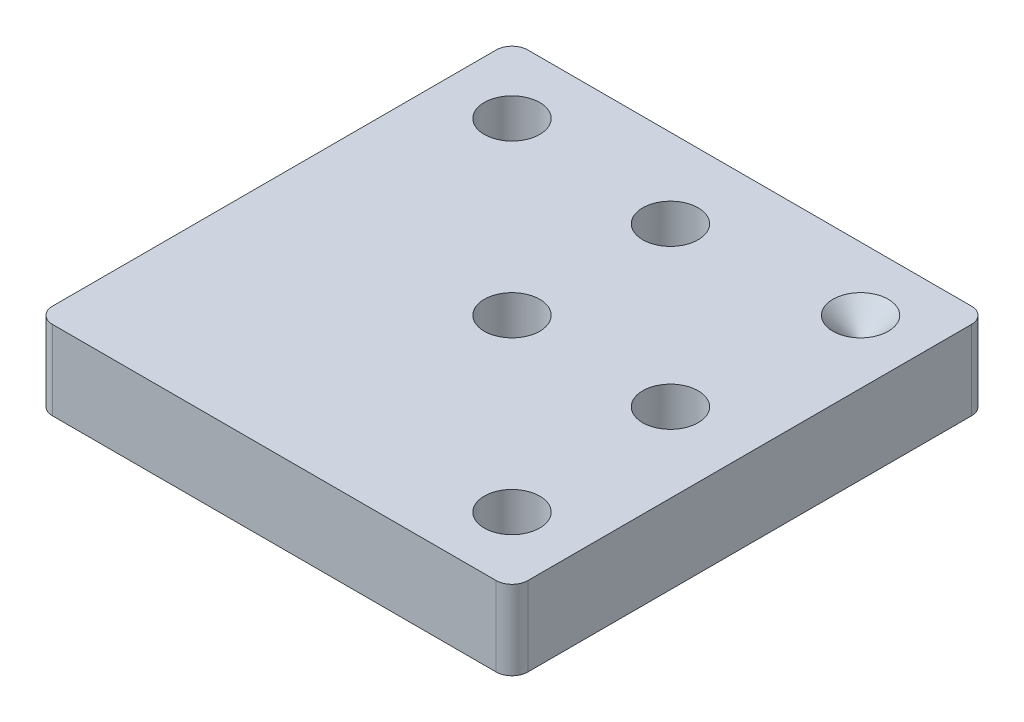
ISO-10303-21;
HEADER;
FILE_DESCRIPTION(('STEP AP214'),'2;1');
FILE_NAME('part.step','',(''),(''),'','','');
FILE_SCHEMA(('AUTOMOTIVE_DESIGN { 1 0 10303 214 1 1 1 1 }'));
ENDSEC;
DATA;
#1=APPLICATION_CONTEXT('core data for automotive mechanical design processes');
#2=APPLICATION_PROTOCOL_DEFINITION('international standard','automotive_design',2000,#1);
#3=PRODUCT_CONTEXT('',#1,'mechanical');
#4=PRODUCT('Part','Part','',(#3));
#5=PRODUCT_RELATED_PRODUCT_CATEGORY('part','',(#4));
#6=PRODUCT_DEFINITION_FORMATION('','',#4);
#7=PRODUCT_DEFINITION_CONTEXT('part definition',#1,'design');
#8=PRODUCT_DEFINITION('design','',#6,#7);
#9=PRODUCT_DEFINITION_SHAPE('','',#8);
#10=(LENGTH_UNIT() NAMED_UNIT(*) SI_UNIT(.MILLI.,.METRE.));
#11=(NAMED_UNIT(*) PLANE_ANGLE_UNIT() SI_UNIT($,.RADIAN.));
#12=(NAMED_UNIT(*) SI_UNIT($,.STERADIAN.) SOLID_ANGLE_UNIT());
#13=UNCERTAINTY_MEASURE_WITH_UNIT(LENGTH_MEASURE(1.E-05),#10,'distance_accuracy_value','');
#14=(GEOMETRIC_REPRESENTATION_CONTEXT(3) GLOBAL_UNCERTAINTY_ASSIGNED_CONTEXT((#13)) GLOBAL_UNIT_ASSIGNED_CONTEXT((#10,
#11,#12)) REPRESENTATION_CONTEXT('',''));
#15=CARTESIAN_POINT('',(0.,0.,0.));
#16=DIRECTION('',(0.,0.,1.));
#17=DIRECTION('',(1.,0.,0.));
#18=AXIS2_PLACEMENT_3D('',#15,#16,#17);
#19=CARTESIAN_POINT('',(25.4,-0.000999999999999265,0.));
#20=DIRECTION('',(0.,1.,0.));
#21=DIRECTION('',(0.,0.,1.));
#22=AXIS2_PLACEMENT_3D('',#19,#20,#21);
#23=CYLINDRICAL_SURFACE('',#22,4.445);
#24=CARTESIAN_POINT('',(25.4,12.7,0.));
#25=DIRECTION('',(0.,1.,0.));
#26=DIRECTION('',(0.,0.,1.));
#27=AXIS2_PLACEMENT_3D('',#24,#25,#26);
#28=CIRCLE('',#27,4.445);
#29=CARTESIAN_POINT('',(25.4,12.7,4.445));
#30=VERTEX_POINT('',#29);
#31=EDGE_CURVE('E157',#30,#30,#28,.T.);
#32=ORIENTED_EDGE('',*,*,#31,.T.);
#33=EDGE_LOOP('',(#32));
#34=FACE_BOUND('',#33,.T.);
#35=CARTESIAN_POINT('',(25.4,3.81,0.));
#36=DIRECTION('',(0.,-1.,0.));
#37=DIRECTION('',(0.,0.,-1.));
#38=AXIS2_PLACEMENT_3D('',#35,#36,#37);
#39=CIRCLE('',#38,4.445);
#40=CARTESIAN_POINT('',(25.4,3.81,-4.44499999999999));
#41=VERTEX_POINT('',#40);
#42=EDGE_CURVE('E152',#41,#41,#39,.F.);
#43=ORIENTED_EDGE('',*,*,#42,.F.);
#44=EDGE_LOOP('',(#43));
#45=FACE_BOUND('',#44,.T.);
#46=ADVANCED_FACE('F41',(#34,#45),#23,.F.);
#47=CARTESIAN_POINT('',(0.,-0.000999999999999265,-25.4));
#48=DIRECTION('',(0.,1.,0.));
#49=DIRECTION('',(0.,0.,1.));
#50=AXIS2_PLACEMENT_3D('',#47,#48,#49);
#51=CYLINDRICAL_SURFACE('',#50,4.445);
#52=CARTESIAN_POINT('',(0.,12.7,-25.4));
#53=DIRECTION('',(0.,1.,0.));
#54=DIRECTION('',(0.,0.,1.));
#55=AXIS2_PLACEMENT_3D('',#52,#53,#54);
#56=CIRCLE('',#55,4.445);
#57=CARTESIAN_POINT('',(0.,12.7,-20.955));
#58=VERTEX_POINT('',#57);
#59=EDGE_CURVE('E310',#58,#58,#56,.T.);
#60=ORIENTED_EDGE('',*,*,#59,.T.);
#61=EDGE_LOOP('',(#60));
#62=FACE_BOUND('',#61,.T.);
#63=CARTESIAN_POINT('',(0.,3.81,-25.4));
#64=DIRECTION('',(0.,-1.,0.));
#65=DIRECTION('',(0.,0.,-1.));
#66=AXIS2_PLACEMENT_3D('',#63,#64,#65);
#67=CIRCLE('',#66,4.445);
#68=CARTESIAN_POINT('',(0.,3.81,-29.845));
#69=VERTEX_POINT('',#68);
#70=EDGE_CURVE('E148',#69,#69,#67,.F.);
#71=ORIENTED_EDGE('',*,*,#70,.F.);
#72=EDGE_LOOP('',(#71));
#73=FACE_BOUND('',#72,.T.);
#74=ADVANCED_FACE('F225',(#62,#73),#51,.F.);
#75=CARTESIAN_POINT('',(38.1,12.7,-38.1));
#76=DIRECTION('',(-1.,0.,0.));
#77=DIRECTION('',(0.,0.,1.));
#78=AXIS2_PLACEMENT_3D('',#75,#76,#77);
#79=PLANE('',#78);
#80=DIRECTION('',(0.,0.,-1.));
#81=VECTOR('',#80,1.);
#82=CARTESIAN_POINT('',(38.1,12.7,-38.1));
#83=LINE('',#82,#81);
#84=CARTESIAN_POINT('',(38.1,12.7,35.56));
#85=VERTEX_POINT('',#84);
#86=CARTESIAN_POINT('',(38.1,12.7,-35.56));
#87=VERTEX_POINT('',#86);
#88=EDGE_CURVE('E137',#85,#87,#83,.T.);
#89=ORIENTED_EDGE('',*,*,#88,.F.);
#90=DIRECTION('',(0.,-1.,0.));
#91=VECTOR('',#90,1.);
#92=CARTESIAN_POINT('',(38.1,12.7,35.56));
#93=LINE('',#92,#91);
#94=CARTESIAN_POINT('',(38.1,0.,35.56));
#95=VERTEX_POINT('',#94);
#96=EDGE_CURVE('E186',#85,#95,#93,.T.);
#97=ORIENTED_EDGE('',*,*,#96,.T.);
#98=DIRECTION('',(0.,0.,-1.));
#99=VECTOR('',#98,1.);
#100=CARTESIAN_POINT('',(38.1,0.,-38.1));
#101=LINE('',#100,#99);
#102=CARTESIAN_POINT('',(38.1,0.,-35.56));
#103=VERTEX_POINT('',#102);
#104=EDGE_CURVE('E201',#95,#103,#101,.T.);
#105=ORIENTED_EDGE('',*,*,#104,.T.);
#106=DIRECTION('',(0.,-1.,0.));
#107=VECTOR('',#106,1.);
#108=CARTESIAN_POINT('',(38.1,12.7,-35.56));
#109=LINE('',#108,#107);
#110=EDGE_CURVE('E183',#103,#87,#109,.F.);
#111=ORIENTED_EDGE('',*,*,#110,.T.);
#112=EDGE_LOOP('',(#89,#97,#105,#111));
#113=FACE_BOUND('',#112,.T.);
#114=ADVANCED_FACE('F222',(#113),#79,.F.);
#115=CARTESIAN_POINT('',(-38.1,12.7,-38.1));
#116=DIRECTION('',(0.,0.,1.));
#117=DIRECTION('',(1.,0.,0.));
#118=AXIS2_PLACEMENT_3D('',#115,#116,#117);
#119=PLANE('',#118);
#120=DIRECTION('',(-1.,0.,0.));
#121=VECTOR('',#120,1.);
#122=CARTESIAN_POINT('',(-38.1,12.7,-38.1));
#123=LINE('',#122,#121);
#124=CARTESIAN_POINT('',(35.56,12.7,-38.1));
#125=VERTEX_POINT('',#124);
#126=CARTESIAN_POINT('',(-35.56,12.7,-38.1));
#127=VERTEX_POINT('',#126);
#128=EDGE_CURVE('E142',#125,#127,#123,.T.);
#129=ORIENTED_EDGE('',*,*,#128,.F.);
#130=DIRECTION('',(0.,-1.,0.));
#131=VECTOR('',#130,1.);
#132=CARTESIAN_POINT('',(35.56,12.7,-38.1));
#133=LINE('',#132,#131);
#134=CARTESIAN_POINT('',(35.56,0.,-38.1));
#135=VERTEX_POINT('',#134);
#136=EDGE_CURVE('E11',#125,#135,#133,.T.);
#137=ORIENTED_EDGE('',*,*,#136,.T.);
#138=DIRECTION('',(-1.,0.,0.));
#139=VECTOR('',#138,1.);
#140=CARTESIAN_POINT('',(-38.1,0.,-38.1));
#141=LINE('',#140,#139);
#142=CARTESIAN_POINT('',(-35.56,0.,-38.1));
#143=VERTEX_POINT('',#142);
#144=EDGE_CURVE('E144',#135,#143,#141,.T.);
#145=ORIENTED_EDGE('',*,*,#144,.T.);
#146=DIRECTION('',(0.,-1.,0.));
#147=VECTOR('',#146,1.);
#148=CARTESIAN_POINT('',(-35.56,12.7,-38.1));
#149=LINE('',#148,#147);
#150=EDGE_CURVE('E50',#143,#127,#149,.F.);
#151=ORIENTED_EDGE('',*,*,#150,.T.);
#152=EDGE_LOOP('',(#129,#137,#145,#151));
#153=FACE_BOUND('',#152,.T.);
#154=ADVANCED_FACE('F207',(#153),#119,.F.);
#155=CARTESIAN_POINT('',(-38.1,12.7,-38.1));
#156=DIRECTION('',(1.,0.,0.));
#157=DIRECTION('',(0.,0.,-1.));
#158=AXIS2_PLACEMENT_3D('',#155,#156,#157);
#159=PLANE('',#158);
#160=DIRECTION('',(0.,0.,1.));
#161=VECTOR('',#160,1.);
#162=CARTESIAN_POINT('',(-38.1,0.,-38.1));
#163=LINE('',#162,#161);
#164=CARTESIAN_POINT('',(-38.1,0.,-35.56));
#165=VERTEX_POINT('',#164);
#166=CARTESIAN_POINT('',(-38.1,0.,35.56));
#167=VERTEX_POINT('',#166);
#168=EDGE_CURVE('E138',#165,#167,#163,.T.);
#169=ORIENTED_EDGE('',*,*,#168,.T.);
#170=DIRECTION('',(0.,-1.,0.));
#171=VECTOR('',#170,1.);
#172=CARTESIAN_POINT('',(-38.1,12.7,35.56));
#173=LINE('',#172,#171);
#174=CARTESIAN_POINT('',(-38.1,12.7,35.56));
#175=VERTEX_POINT('',#174);
#176=EDGE_CURVE('E113',#167,#175,#173,.F.);
#177=ORIENTED_EDGE('',*,*,#176,.T.);
#178=DIRECTION('',(0.,0.,1.));
#179=VECTOR('',#178,1.);
#180=CARTESIAN_POINT('',(-38.1,12.7,-38.1));
#181=LINE('',#180,#179);
#182=CARTESIAN_POINT('',(-38.1,12.7,-35.56));
#183=VERTEX_POINT('',#182);
#184=EDGE_CURVE('E192',#183,#175,#181,.T.);
#185=ORIENTED_EDGE('',*,*,#184,.F.);
#186=DIRECTION('',(0.,-1.,0.));
#187=VECTOR('',#186,1.);
#188=CARTESIAN_POINT('',(-38.1,12.7,-35.56));
#189=LINE('',#188,#187);
#190=EDGE_CURVE('E119',#183,#165,#189,.T.);
#191=ORIENTED_EDGE('',*,*,#190,.T.);
#192=EDGE_LOOP('',(#169,#177,#185,#191));
#193=FACE_BOUND('',#192,.T.);
#194=ADVANCED_FACE('F214',(#193),#159,.F.);
#195=CARTESIAN_POINT('',(-38.1,12.7,38.1));
#196=DIRECTION('',(0.,0.,-1.));
#197=DIRECTION('',(-1.,0.,0.));
#198=AXIS2_PLACEMENT_3D('',#195,#196,#197);
#199=PLANE('',#198);
#200=DIRECTION('',(1.,0.,0.));
#201=VECTOR('',#200,1.);
#202=CARTESIAN_POINT('',(-38.1,12.7,38.1));
#203=LINE('',#202,#201);
#204=CARTESIAN_POINT('',(-35.56,12.7,38.1));
#205=VERTEX_POINT('',#204);
#206=CARTESIAN_POINT('',(35.56,12.7,38.1));
#207=VERTEX_POINT('',#206);
#208=EDGE_CURVE('E129',#205,#207,#203,.T.);
#209=ORIENTED_EDGE('',*,*,#208,.F.);
#210=DIRECTION('',(0.,-1.,0.));
#211=VECTOR('',#210,1.);
#212=CARTESIAN_POINT('',(-35.56,12.7,38.1));
#213=LINE('',#212,#211);
#214=CARTESIAN_POINT('',(-35.56,0.,38.1));
#215=VERTEX_POINT('',#214);
#216=EDGE_CURVE('E112',#205,#215,#213,.T.);
#217=ORIENTED_EDGE('',*,*,#216,.T.);
#218=DIRECTION('',(1.,0.,0.));
#219=VECTOR('',#218,1.);
#220=CARTESIAN_POINT('',(-38.1,0.,38.1));
#221=LINE('',#220,#219);
#222=CARTESIAN_POINT('',(35.56,0.,38.1));
#223=VERTEX_POINT('',#222);
#224=EDGE_CURVE('E126',#215,#223,#221,.T.);
#225=ORIENTED_EDGE('',*,*,#224,.T.);
#226=DIRECTION('',(0.,-1.,0.));
#227=VECTOR('',#226,1.);
#228=CARTESIAN_POINT('',(35.56,12.7,38.1));
#229=LINE('',#228,#227);
#230=EDGE_CURVE('E132',#223,#207,#229,.F.);
#231=ORIENTED_EDGE('',*,*,#230,.T.);
#232=EDGE_LOOP('',(#209,#217,#225,#231));
#233=FACE_BOUND('',#232,.T.);
#234=ADVANCED_FACE('F125',(#233),#199,.F.);
#235=CARTESIAN_POINT('',(0.,12.7,0.));
#236=DIRECTION('',(0.,1.,0.));
#237=DIRECTION('',(0.,0.,1.));
#238=AXIS2_PLACEMENT_3D('',#235,#236,#237);
#239=PLANE('',#238);
#240=ORIENTED_EDGE('',*,*,#59,.F.);
#241=EDGE_LOOP('',(#240));
#242=FACE_BOUND('',#241,.T.);
#243=ORIENTED_EDGE('',*,*,#31,.F.);
#244=EDGE_LOOP('',(#243));
#245=FACE_BOUND('',#244,.T.);
#246=CARTESIAN_POINT('',(27.94,12.7,-27.94));
#247=DIRECTION('',(0.,1.,0.));
#248=DIRECTION('',(0.,0.,1.));
#249=AXIS2_PLACEMENT_3D('',#246,#247,#248);
#250=CIRCLE('',#249,4.44499999999999);
#251=CARTESIAN_POINT('',(27.94,12.7,-23.495));
#252=VERTEX_POINT('',#251);
#253=EDGE_CURVE('E306',#252,#252,#250,.T.);
#254=ORIENTED_EDGE('',*,*,#253,.F.);
#255=EDGE_LOOP('',(#254));
#256=FACE_BOUND('',#255,.T.);
#257=CARTESIAN_POINT('',(-27.323692654717,12.7,-27.323692654717));
#258=DIRECTION('',(0.,1.,0.));
#259=DIRECTION('',(0.,0.,1.));
#260=AXIS2_PLACEMENT_3D('',#257,#258,#259);
#261=CIRCLE('',#260,4.44499999999999);
#262=CARTESIAN_POINT('',(-27.323692654717,12.7,-22.878692654717));
#263=VERTEX_POINT('',#262);
#264=EDGE_CURVE('E292',#263,#263,#261,.T.);
#265=ORIENTED_EDGE('',*,*,#264,.F.);
#266=EDGE_LOOP('',(#265));
#267=FACE_BOUND('',#266,.T.);
#268=CARTESIAN_POINT('',(27.323692654717,12.7,27.323692654717));
#269=DIRECTION('',(0.,1.,0.));
#270=DIRECTION('',(0.,0.,1.));
#271=AXIS2_PLACEMENT_3D('',#268,#269,#270);
#272=CIRCLE('',#271,4.44499999999999);
#273=CARTESIAN_POINT('',(27.323692654717,12.7,31.768692654717));
#274=VERTEX_POINT('',#273);
#275=EDGE_CURVE('E293',#274,#274,#272,.T.);
#276=ORIENTED_EDGE('',*,*,#275,.F.);
#277=EDGE_LOOP('',(#276));
#278=FACE_BOUND('',#277,.T.);
#279=CARTESIAN_POINT('',(0.,12.7,0.));
#280=DIRECTION('',(0.,1.,0.));
#281=DIRECTION('',(0.,0.,1.));
#282=AXIS2_PLACEMENT_3D('',#279,#280,#281);
#283=CIRCLE('',#282,4.445);
#284=CARTESIAN_POINT('',(0.,12.7,4.445));
#285=VERTEX_POINT('',#284);
#286=EDGE_CURVE('E285',#285,#285,#283,.F.);
#287=ORIENTED_EDGE('',*,*,#286,.T.);
#288=EDGE_LOOP('',(#287));
#289=FACE_BOUND('',#288,.T.);
#290=ORIENTED_EDGE('',*,*,#184,.T.);
#291=CARTESIAN_POINT('',(-35.56,12.7,35.56));
#292=DIRECTION('',(0.,1.,0.));
#293=DIRECTION('',(0.,0.,1.));
#294=AXIS2_PLACEMENT_3D('',#291,#292,#293);
#295=CIRCLE('',#294,2.54);
#296=EDGE_CURVE('E180',#175,#205,#295,.T.);
#297=ORIENTED_EDGE('',*,*,#296,.T.);
#298=ORIENTED_EDGE('',*,*,#208,.T.);
#299=CARTESIAN_POINT('',(35.56,12.7,35.56));
#300=DIRECTION('',(0.,1.,0.));
#301=DIRECTION('',(0.,0.,1.));
#302=AXIS2_PLACEMENT_3D('',#299,#300,#301);
#303=CIRCLE('',#302,2.54);
#304=EDGE_CURVE('E177',#207,#85,#303,.T.);
#305=ORIENTED_EDGE('',*,*,#304,.T.);
#306=ORIENTED_EDGE('',*,*,#88,.T.);
#307=CARTESIAN_POINT('',(35.56,12.7,-35.56));
#308=DIRECTION('',(0.,1.,0.));
#309=DIRECTION('',(0.,0.,1.));
#310=AXIS2_PLACEMENT_3D('',#307,#308,#309);
#311=CIRCLE('',#310,2.54);
#312=EDGE_CURVE('E63',#87,#125,#311,.T.);
#313=ORIENTED_EDGE('',*,*,#312,.T.);
#314=ORIENTED_EDGE('',*,*,#128,.T.);
#315=CARTESIAN_POINT('',(-35.56,12.7,-35.56));
#316=DIRECTION('',(0.,1.,0.));
#317=DIRECTION('',(0.,0.,1.));
#318=AXIS2_PLACEMENT_3D('',#315,#316,#317);
#319=CIRCLE('',#318,2.54);
#320=EDGE_CURVE('E172',#127,#183,#319,.T.);
#321=ORIENTED_EDGE('',*,*,#320,.T.);
#322=EDGE_LOOP('',(#290,#297,#298,#305,#306,#313,#314,#321));
#323=FACE_BOUND('',#322,.T.);
#324=ADVANCED_FACE('F212',(#242,#245,#256,#267,#278,#289,#323),#239,.T.);
#325=CARTESIAN_POINT('',(0.,0.,0.));
#326=DIRECTION('',(0.,1.,0.));
#327=DIRECTION('',(0.,0.,1.));
#328=AXIS2_PLACEMENT_3D('',#325,#326,#327);
#329=PLANE('',#328);
#330=CARTESIAN_POINT('',(25.4,0.,0.));
#331=DIRECTION('',(0.,-1.,0.));
#332=DIRECTION('',(0.,0.,-1.));
#333=AXIS2_PLACEMENT_3D('',#330,#331,#332);
#334=CIRCLE('',#333,6.85800000000001);
#335=CARTESIAN_POINT('',(25.4,0.,-6.858));
#336=VERTEX_POINT('',#335);
#337=EDGE_CURVE('E268',#336,#336,#334,.T.);
#338=ORIENTED_EDGE('',*,*,#337,.F.);
#339=EDGE_LOOP('',(#338));
#340=FACE_BOUND('',#339,.T.);
#341=CARTESIAN_POINT('',(0.,0.,-25.4));
#342=DIRECTION('',(0.,-1.,0.));
#343=DIRECTION('',(0.,0.,-1.));
#344=AXIS2_PLACEMENT_3D('',#341,#342,#343);
#345=CIRCLE('',#344,6.858);
#346=CARTESIAN_POINT('',(0.,0.,-32.258));
#347=VERTEX_POINT('',#346);
#348=EDGE_CURVE('E272',#347,#347,#345,.T.);
#349=ORIENTED_EDGE('',*,*,#348,.F.);
#350=EDGE_LOOP('',(#349));
#351=FACE_BOUND('',#350,.T.);
#352=CARTESIAN_POINT('',(-27.323692654717,0.,-27.323692654717));
#353=DIRECTION('',(0.,1.,0.));
#354=DIRECTION('',(0.,0.,1.));
#355=AXIS2_PLACEMENT_3D('',#352,#353,#354);
#356=CIRCLE('',#355,4.44499999999999);
#357=CARTESIAN_POINT('',(-27.323692654717,0.,-22.878692654717));
#358=VERTEX_POINT('',#357);
#359=EDGE_CURVE('E276',#358,#358,#356,.F.);
#360=ORIENTED_EDGE('',*,*,#359,.F.);
#361=EDGE_LOOP('',(#360));
#362=FACE_BOUND('',#361,.T.);
#363=CARTESIAN_POINT('',(27.323692654717,0.,27.323692654717));
#364=DIRECTION('',(0.,1.,0.));
#365=DIRECTION('',(0.,0.,1.));
#366=AXIS2_PLACEMENT_3D('',#363,#364,#365);
#367=CIRCLE('',#366,4.44499999999999);
#368=CARTESIAN_POINT('',(27.323692654717,0.,31.768692654717));
#369=VERTEX_POINT('',#368);
#370=EDGE_CURVE('E280',#369,#369,#367,.F.);
#371=ORIENTED_EDGE('',*,*,#370,.F.);
#372=EDGE_LOOP('',(#371));
#373=FACE_BOUND('',#372,.T.);
#374=CARTESIAN_POINT('',(0.,0.,0.));
#375=DIRECTION('',(0.,-1.,0.));
#376=DIRECTION('',(0.,0.,-1.));
#377=AXIS2_PLACEMENT_3D('',#374,#375,#376);
#378=CIRCLE('',#377,4.445);
#379=CARTESIAN_POINT('',(0.,0.,-4.445));
#380=VERTEX_POINT('',#379);
#381=EDGE_CURVE('E204',#380,#380,#378,.T.);
#382=ORIENTED_EDGE('',*,*,#381,.F.);
#383=EDGE_LOOP('',(#382));
#384=FACE_BOUND('',#383,.T.);
#385=ORIENTED_EDGE('',*,*,#224,.F.);
#386=CARTESIAN_POINT('',(-35.56,0.,35.56));
#387=DIRECTION('',(0.,1.,0.));
#388=DIRECTION('',(0.,0.,1.));
#389=AXIS2_PLACEMENT_3D('',#386,#387,#388);
#390=CIRCLE('',#389,2.54);
#391=EDGE_CURVE('E108',#215,#167,#390,.F.);
#392=ORIENTED_EDGE('',*,*,#391,.T.);
#393=ORIENTED_EDGE('',*,*,#168,.F.);
#394=CARTESIAN_POINT('',(-35.56,0.,-35.56));
#395=DIRECTION('',(0.,1.,0.));
#396=DIRECTION('',(0.,0.,1.));
#397=AXIS2_PLACEMENT_3D('',#394,#395,#396);
#398=CIRCLE('',#397,2.54);
#399=EDGE_CURVE('E131',#165,#143,#398,.F.);
#400=ORIENTED_EDGE('',*,*,#399,.T.);
#401=ORIENTED_EDGE('',*,*,#144,.F.);
#402=CARTESIAN_POINT('',(35.56,0.,-35.56));
#403=DIRECTION('',(0.,1.,0.));
#404=DIRECTION('',(0.,0.,1.));
#405=AXIS2_PLACEMENT_3D('',#402,#403,#404);
#406=CIRCLE('',#405,2.54);
#407=EDGE_CURVE('E162',#135,#103,#406,.F.);
#408=ORIENTED_EDGE('',*,*,#407,.T.);
#409=ORIENTED_EDGE('',*,*,#104,.F.);
#410=CARTESIAN_POINT('',(35.56,0.,35.56));
#411=DIRECTION('',(0.,1.,0.));
#412=DIRECTION('',(0.,0.,1.));
#413=AXIS2_PLACEMENT_3D('',#410,#411,#412);
#414=CIRCLE('',#413,2.54);
#415=EDGE_CURVE('E120',#95,#223,#414,.F.);
#416=ORIENTED_EDGE('',*,*,#415,.T.);
#417=EDGE_LOOP('',(#385,#392,#393,#400,#401,#408,#409,#416));
#418=FACE_BOUND('',#417,.T.);
#419=ADVANCED_FACE('F134',(#340,#351,#362,#373,#384,#418),#329,.F.);
#420=CARTESIAN_POINT('',(0.,12.701,0.));
#421=DIRECTION('',(0.,-1.,0.));
#422=DIRECTION('',(0.,0.,-1.));
#423=AXIS2_PLACEMENT_3D('',#420,#421,#422);
#424=CYLINDRICAL_SURFACE('',#423,4.445);
#425=ORIENTED_EDGE('',*,*,#286,.F.);
#426=EDGE_LOOP('',(#425));
#427=FACE_BOUND('',#426,.T.);
#428=ORIENTED_EDGE('',*,*,#381,.T.);
#429=EDGE_LOOP('',(#428));
#430=FACE_BOUND('',#429,.T.);
#431=ADVANCED_FACE('F253',(#427,#430),#424,.F.);
#432=CARTESIAN_POINT('',(27.323692654717,-0.000999999999999265,27.323692654717));
#433=DIRECTION('',(0.,1.,0.));
#434=DIRECTION('',(0.,0.,1.));
#435=AXIS2_PLACEMENT_3D('',#432,#433,#434);
#436=CYLINDRICAL_SURFACE('',#435,4.44499999999999);
#437=ORIENTED_EDGE('',*,*,#275,.T.);
#438=EDGE_LOOP('',(#437));
#439=FACE_BOUND('',#438,.T.);
#440=ORIENTED_EDGE('',*,*,#370,.T.);
#441=EDGE_LOOP('',(#440));
#442=FACE_BOUND('',#441,.T.);
#443=ADVANCED_FACE('F249',(#439,#442),#436,.F.);
#444=CARTESIAN_POINT('',(-27.323692654717,-0.000999999999999265,-27.323692654717));
#445=DIRECTION('',(0.,1.,0.));
#446=DIRECTION('',(0.,0.,1.));
#447=AXIS2_PLACEMENT_3D('',#444,#445,#446);
#448=CYLINDRICAL_SURFACE('',#447,4.44499999999999);
#449=ORIENTED_EDGE('',*,*,#264,.T.);
#450=EDGE_LOOP('',(#449));
#451=FACE_BOUND('',#450,.T.);
#452=ORIENTED_EDGE('',*,*,#359,.T.);
#453=EDGE_LOOP('',(#452));
#454=FACE_BOUND('',#453,.T.);
#455=ADVANCED_FACE('F245',(#451,#454),#448,.F.);
#456=CARTESIAN_POINT('',(27.94,12.7,-27.94));
#457=DIRECTION('',(0.,1.,0.));
#458=DIRECTION('',(0.,0.,1.));
#459=AXIS2_PLACEMENT_3D('',#456,#457,#458);
#460=CONICAL_SURFACE('',#459,4.44499999999999,0.78539816339745);
#461=CARTESIAN_POINT('',(27.94,8.89,-27.94));
#462=DIRECTION('',(0.,1.,0.));
#463=DIRECTION('',(0.,0.,1.));
#464=AXIS2_PLACEMENT_3D('',#461,#462,#463);
#465=CIRCLE('',#464,0.634999999999983);
#466=CARTESIAN_POINT('',(27.94,8.89,-27.305));
#467=VERTEX_POINT('',#466);
#468=EDGE_CURVE('E297',#467,#467,#465,.T.);
#469=CARTESIAN_POINT('',(27.94,8.89,-27.305));
#470=CARTESIAN_POINT('',(27.94,8.9296875,-27.2653125));
#471=CARTESIAN_POINT('',(27.94,8.969375,-27.225625));
#472=CARTESIAN_POINT('',(27.94,9.04875,-27.14625));
#473=CARTESIAN_POINT('',(27.94,9.0884375,-27.1065625));
#474=CARTESIAN_POINT('',(27.94,9.1678125,-27.0271875));
#475=CARTESIAN_POINT('',(27.94,9.2075,-26.9875));
#476=CARTESIAN_POINT('',(27.94,9.286875,-26.908125));
#477=CARTESIAN_POINT('',(27.94,9.3265625,-26.8684375));
#478=CARTESIAN_POINT('',(27.94,9.4059375,-26.7890625));
#479=CARTESIAN_POINT('',(27.94,9.445625,-26.749375));
#480=CARTESIAN_POINT('',(27.94,9.525,-26.67));
#481=CARTESIAN_POINT('',(27.94,9.5646875,-26.6303125));
#482=CARTESIAN_POINT('',(27.94,9.6440625,-26.5509375));
#483=CARTESIAN_POINT('',(27.94,9.68375,-26.51125));
#484=CARTESIAN_POINT('',(27.94,9.763125,-26.431875));
#485=CARTESIAN_POINT('',(27.94,9.8028125,-26.3921875));
#486=CARTESIAN_POINT('',(27.94,9.8821875,-26.3128125));
#487=CARTESIAN_POINT('',(27.94,9.921875,-26.273125));
#488=CARTESIAN_POINT('',(27.94,10.00125,-26.19375));
#489=CARTESIAN_POINT('',(27.94,10.0409375,-26.1540625));
#490=CARTESIAN_POINT('',(27.94,10.1203125,-26.0746875));
#491=CARTESIAN_POINT('',(27.94,10.16,-26.035));
#492=CARTESIAN_POINT('',(27.94,10.239375,-25.955625));
#493=CARTESIAN_POINT('',(27.94,10.2790625,-25.9159375));
#494=CARTESIAN_POINT('',(27.94,10.3584375,-25.8365625));
#495=CARTESIAN_POINT('',(27.94,10.398125,-25.796875));
#496=CARTESIAN_POINT('',(27.94,10.4775,-25.7175));
#497=CARTESIAN_POINT('',(27.94,10.5171875,-25.6778125));
#498=CARTESIAN_POINT('',(27.94,10.5965625,-25.5984375));
#499=CARTESIAN_POINT('',(27.94,10.63625,-25.55875));
#500=CARTESIAN_POINT('',(27.94,10.715625,-25.479375));
#501=CARTESIAN_POINT('',(27.94,10.7553125,-25.4396875));
#502=CARTESIAN_POINT('',(27.94,10.8346875,-25.3603125));
#503=CARTESIAN_POINT('',(27.94,10.874375,-25.320625));
#504=CARTESIAN_POINT('',(27.94,10.95375,-25.24125));
#505=CARTESIAN_POINT('',(27.94,10.9934375,-25.2015625));
#506=CARTESIAN_POINT('',(27.94,11.0728125,-25.1221875));
#507=CARTESIAN_POINT('',(27.94,11.1125,-25.0825));
#508=CARTESIAN_POINT('',(27.94,11.191875,-25.003125));
#509=CARTESIAN_POINT('',(27.94,11.2315625,-24.9634375));
#510=CARTESIAN_POINT('',(27.94,11.3109375,-24.8840625));
#511=CARTESIAN_POINT('',(27.94,11.350625,-24.844375));
#512=CARTESIAN_POINT('',(27.94,11.43,-24.765));
#513=CARTESIAN_POINT('',(27.94,11.4696875,-24.7253125));
#514=CARTESIAN_POINT('',(27.94,11.5490625,-24.6459375));
#515=CARTESIAN_POINT('',(27.94,11.58875,-24.60625));
#516=CARTESIAN_POINT('',(27.94,11.668125,-24.526875));
#517=CARTESIAN_POINT('',(27.94,11.7078125,-24.4871875));
#518=CARTESIAN_POINT('',(27.94,11.7871875,-24.4078125));
#519=CARTESIAN_POINT('',(27.94,11.826875,-24.368125));
#520=CARTESIAN_POINT('',(27.94,11.90625,-24.28875));
#521=CARTESIAN_POINT('',(27.94,11.9459375,-24.2490625));
#522=CARTESIAN_POINT('',(27.94,12.0253125,-24.1696875));
#523=CARTESIAN_POINT('',(27.94,12.065,-24.13));
#524=CARTESIAN_POINT('',(27.94,12.144375,-24.050625));
#525=CARTESIAN_POINT('',(27.94,12.1840625,-24.0109375));
#526=CARTESIAN_POINT('',(27.94,12.2634375,-23.9315625));
#527=CARTESIAN_POINT('',(27.94,12.303125,-23.891875));
#528=CARTESIAN_POINT('',(27.94,12.3825,-23.8125));
#529=CARTESIAN_POINT('',(27.94,12.4221875,-23.7728125));
#530=CARTESIAN_POINT('',(27.94,12.5015625,-23.6934375));
#531=CARTESIAN_POINT('',(27.94,12.54125,-23.65375));
#532=CARTESIAN_POINT('',(27.94,12.620625,-23.574375));
#533=CARTESIAN_POINT('',(27.94,12.6603125,-23.5346875));
#534=CARTESIAN_POINT('',(27.94,12.7,-23.495));
#535=B_SPLINE_CURVE_WITH_KNOTS('',3,(#469,#470,#471,#472,#473,#474,#475,#476,#477,#478,#479,
#480,#481,#482,#483,#484,#485,#486,#487,#488,#489,#490,#491,#492,#493,#494,#495,#496,#497,#498,
#499,#500,#501,#502,#503,#504,#505,#506,#507,#508,#509,#510,#511,#512,#513,#514,#515,#516,#517,
#518,#519,#520,#521,#522,#523,#524,#525,#526,#527,#528,#529,#530,#531,#532,#533,#534),
.UNSPECIFIED.,.F.,.F.,(4,2,2,2,2,2,2,2,2,2,2,2,2,2,2,2,2,2,2,2,2,2,2,2,2,2,2,2,2,2,2,2,4),(0.,
0.168379802270047,0.336759604540093,0.505139406810142,0.673519209080188,0.841899011350234,
1.01027881362028,1.17865861589033,1.34703841816037,1.51541822043042,1.68379802270047,
1.85217782497052,2.02055762724056,2.18893742951061,2.35731723178066,2.5256970340507,
2.69407683632075,2.8624566385908,3.03083644086084,3.19921624313089,3.36759604540094,
3.53597584767099,3.70435564994103,3.87273545221108,4.04111525448113,4.20949505675117,
4.37787485902122,4.54625466129127,4.71463446356131,4.88301426583136,5.05139406810141,
5.21977387037145,5.3881536726415),.UNSPECIFIED.);
#536=EDGE_CURVE('BSEAM241',#467,#252,#535,.T.);
#537=ORIENTED_EDGE('',*,*,#468,.F.);
#538=ORIENTED_EDGE('',*,*,#253,.T.);
#539=ORIENTED_EDGE('',*,*,#536,.T.);
#540=ORIENTED_EDGE('',*,*,#536,.F.);
#541=EDGE_LOOP('',(#537,#539,#538,#540));
#542=FACE_BOUND('',#541,.T.);
#543=ADVANCED_FACE('F241',(#542),#460,.F.);
#544=CARTESIAN_POINT('',(27.94,8.89,-27.94));
#545=DIRECTION('',(0.,1.,0.));
#546=DIRECTION('',(0.,0.,1.));
#547=AXIS2_PLACEMENT_3D('',#544,#545,#546);
#548=PLANE('',#547);
#549=ORIENTED_EDGE('',*,*,#468,.T.);
#550=EDGE_LOOP('',(#549));
#551=FACE_BOUND('',#550,.T.);
#552=ADVANCED_FACE('F237',(#551),#548,.T.);
#553=CARTESIAN_POINT('',(0.,3.81,-25.4));
#554=DIRECTION('',(0.,-1.,0.));
#555=DIRECTION('',(0.,0.,-1.));
#556=AXIS2_PLACEMENT_3D('',#553,#554,#555);
#557=PLANE('',#556);
#558=CARTESIAN_POINT('',(0.,3.81,-25.4));
#559=DIRECTION('',(0.,-1.,0.));
#560=DIRECTION('',(0.,0.,-1.));
#561=AXIS2_PLACEMENT_3D('',#558,#559,#560);
#562=CIRCLE('',#561,6.858);
#563=CARTESIAN_POINT('',(0.,3.81,-32.258));
#564=VERTEX_POINT('',#563);
#565=EDGE_CURVE('E318',#564,#564,#562,.T.);
#566=ORIENTED_EDGE('',*,*,#565,.T.);
#567=EDGE_LOOP('',(#566));
#568=FACE_BOUND('',#567,.T.);
#569=ORIENTED_EDGE('',*,*,#70,.T.);
#570=EDGE_LOOP('',(#569));
#571=FACE_BOUND('',#570,.T.);
#572=ADVANCED_FACE('F240',(#568,#571),#557,.T.);
#573=CARTESIAN_POINT('',(0.,3.81,-25.4));
#574=DIRECTION('',(0.,-1.,0.));
#575=DIRECTION('',(0.,0.,-1.));
#576=AXIS2_PLACEMENT_3D('',#573,#574,#575);
#577=CYLINDRICAL_SURFACE('',#576,6.858);
#578=CARTESIAN_POINT('',(0.,3.81,-32.258));
#579=CARTESIAN_POINT('',(0.,3.7703125,-32.258));
#580=CARTESIAN_POINT('',(0.,3.730625,-32.258));
#581=CARTESIAN_POINT('',(0.,3.65125,-32.258));
#582=CARTESIAN_POINT('',(0.,3.6115625,-32.258));
#583=CARTESIAN_POINT('',(0.,3.5321875,-32.258));
#584=CARTESIAN_POINT('',(0.,3.4925,-32.258));
#585=CARTESIAN_POINT('',(0.,3.413125,-32.258));
#586=CARTESIAN_POINT('',(0.,3.3734375,-32.258));
#587=CARTESIAN_POINT('',(0.,3.2940625,-32.258));
#588=CARTESIAN_POINT('',(0.,3.254375,-32.258));
#589=CARTESIAN_POINT('',(0.,3.175,-32.258));
#590=CARTESIAN_POINT('',(0.,3.1353125,-32.258));
#591=CARTESIAN_POINT('',(0.,3.0559375,-32.258));
#592=CARTESIAN_POINT('',(0.,3.01625,-32.258));
#593=CARTESIAN_POINT('',(0.,2.936875,-32.258));
#594=CARTESIAN_POINT('',(0.,2.8971875,-32.258));
#595=CARTESIAN_POINT('',(0.,2.8178125,-32.258));
#596=CARTESIAN_POINT('',(0.,2.778125,-32.258));
#597=CARTESIAN_POINT('',(0.,2.69875,-32.258));
#598=CARTESIAN_POINT('',(0.,2.6590625,-32.258));
#599=CARTESIAN_POINT('',(0.,2.5796875,-32.258));
#600=CARTESIAN_POINT('',(0.,2.54,-32.258));
#601=CARTESIAN_POINT('',(0.,2.460625,-32.258));
#602=CARTESIAN_POINT('',(0.,2.4209375,-32.258));
#603=CARTESIAN_POINT('',(0.,2.3415625,-32.258));
#604=CARTESIAN_POINT('',(0.,2.301875,-32.258));
#605=CARTESIAN_POINT('',(0.,2.2225,-32.258));
#606=CARTESIAN_POINT('',(0.,2.1828125,-32.258));
#607=CARTESIAN_POINT('',(0.,2.1034375,-32.258));
#608=CARTESIAN_POINT('',(0.,2.06375,-32.258));
#609=CARTESIAN_POINT('',(0.,1.984375,-32.258));
#610=CARTESIAN_POINT('',(0.,1.9446875,-32.258));
#611=CARTESIAN_POINT('',(0.,1.8653125,-32.258));
#612=CARTESIAN_POINT('',(0.,1.825625,-32.258));
#613=CARTESIAN_POINT('',(0.,1.74625,-32.258));
#614=CARTESIAN_POINT('',(0.,1.7065625,-32.258));
#615=CARTESIAN_POINT('',(0.,1.6271875,-32.258));
#616=CARTESIAN_POINT('',(0.,1.5875,-32.258));
#617=CARTESIAN_POINT('',(0.,1.508125,-32.258));
#618=CARTESIAN_POINT('',(0.,1.4684375,-32.258));
#619=CARTESIAN_POINT('',(0.,1.3890625,-32.258));
#620=CARTESIAN_POINT('',(0.,1.349375,-32.258));
#621=CARTESIAN_POINT('',(0.,1.27,-32.258));
#622=CARTESIAN_POINT('',(0.,1.2303125,-32.258));
#623=CARTESIAN_POINT('',(0.,1.1509375,-32.258));
#624=CARTESIAN_POINT('',(0.,1.11125,-32.258));
#625=CARTESIAN_POINT('',(0.,1.031875,-32.258));
#626=CARTESIAN_POINT('',(0.,0.9921875,-32.258));
#627=CARTESIAN_POINT('',(0.,0.9128125,-32.258));
#628=CARTESIAN_POINT('',(0.,0.873125,-32.258));
#629=CARTESIAN_POINT('',(0.,0.79375,-32.258));
#630=CARTESIAN_POINT('',(0.,0.7540625,-32.258));
#631=CARTESIAN_POINT('',(0.,0.6746875,-32.258));
#632=CARTESIAN_POINT('',(0.,0.635,-32.258));
#633=CARTESIAN_POINT('',(0.,0.555625,-32.258));
#634=CARTESIAN_POINT('',(0.,0.5159375,-32.258));
#635=CARTESIAN_POINT('',(0.,0.4365625,-32.258));
#636=CARTESIAN_POINT('',(0.,0.396875,-32.258));
#637=CARTESIAN_POINT('',(0.,0.3175,-32.258));
#638=CARTESIAN_POINT('',(0.,0.2778125,-32.258));
#639=CARTESIAN_POINT('',(0.,0.1984375,-32.258));
#640=CARTESIAN_POINT('',(0.,0.15875,-32.258));
#641=CARTESIAN_POINT('',(0.,0.0793749999999999,-32.258));
#642=CARTESIAN_POINT('',(0.,0.0396874999999999,-32.258));
#643=CARTESIAN_POINT('',(0.,0.,-32.258));
#644=B_SPLINE_CURVE_WITH_KNOTS('',3,(#578,#579,#580,#581,#582,#583,#584,#585,#586,#587,#588,
#589,#590,#591,#592,#593,#594,#595,#596,#597,#598,#599,#600,#601,#602,#603,#604,#605,#606,#607,
#608,#609,#610,#611,#612,#613,#614,#615,#616,#617,#618,#619,#620,#621,#622,#623,#624,#625,#626,
#627,#628,#629,#630,#631,#632,#633,#634,#635,#636,#637,#638,#639,#640,#641,#642,#643),
.UNSPECIFIED.,.F.,.F.,(4,2,2,2,2,2,2,2,2,2,2,2,2,2,2,2,2,2,2,2,2,2,2,2,2,2,2,2,2,2,2,2,4),(0.,
0.1190625,0.238125,0.3571875,0.47625,0.5953125,0.714375,0.8334375,0.9525,1.0715625,1.190625,
1.3096875,1.42875,1.5478125,1.666875,1.7859375,1.905,2.0240625,2.143125,2.2621875,2.38125,
2.5003125,2.619375,2.7384375,2.8575,2.9765625,3.095625,3.2146875,3.33375,3.4528125,3.571875,
3.6909375,3.81),.UNSPECIFIED.);
#645=EDGE_CURVE('BSEAM341',#564,#347,#644,.T.);
#646=ORIENTED_EDGE('',*,*,#565,.F.);
#647=ORIENTED_EDGE('',*,*,#348,.T.);
#648=ORIENTED_EDGE('',*,*,#645,.T.);
#649=ORIENTED_EDGE('',*,*,#645,.F.);
#650=EDGE_LOOP('',(#646,#648,#647,#649));
#651=FACE_BOUND('',#650,.T.);
#652=ADVANCED_FACE('F341',(#651),#577,.F.);
#653=CARTESIAN_POINT('',(25.4,3.81,0.));
#654=DIRECTION('',(0.,-1.,0.));
#655=DIRECTION('',(0.,0.,-1.));
#656=AXIS2_PLACEMENT_3D('',#653,#654,#655);
#657=PLANE('',#656);
#658=CARTESIAN_POINT('',(25.4,3.81,0.));
#659=DIRECTION('',(0.,-1.,0.));
#660=DIRECTION('',(0.,0.,-1.));
#661=AXIS2_PLACEMENT_3D('',#658,#659,#660);
#662=CIRCLE('',#661,6.85800000000001);
#663=CARTESIAN_POINT('',(25.4,3.81,-6.858));
#664=VERTEX_POINT('',#663);
#665=EDGE_CURVE('E153',#664,#664,#662,.T.);
#666=ORIENTED_EDGE('',*,*,#665,.T.);
#667=EDGE_LOOP('',(#666));
#668=FACE_BOUND('',#667,.T.);
#669=ORIENTED_EDGE('',*,*,#42,.T.);
#670=EDGE_LOOP('',(#669));
#671=FACE_BOUND('',#670,.T.);
#672=ADVANCED_FACE('F328',(#668,#671),#657,.T.);
#673=CARTESIAN_POINT('',(25.4,3.81,0.));
#674=DIRECTION('',(0.,-1.,0.));
#675=DIRECTION('',(0.,0.,-1.));
#676=AXIS2_PLACEMENT_3D('',#673,#674,#675);
#677=CYLINDRICAL_SURFACE('',#676,6.85800000000001);
#678=CARTESIAN_POINT('',(25.4,3.81,-6.858));
#679=CARTESIAN_POINT('',(25.4,3.7703125,-6.858));
#680=CARTESIAN_POINT('',(25.4,3.730625,-6.858));
#681=CARTESIAN_POINT('',(25.4,3.65125,-6.858));
#682=CARTESIAN_POINT('',(25.4,3.6115625,-6.858));
#683=CARTESIAN_POINT('',(25.4,3.5321875,-6.858));
#684=CARTESIAN_POINT('',(25.4,3.4925,-6.858));
#685=CARTESIAN_POINT('',(25.4,3.413125,-6.858));
#686=CARTESIAN_POINT('',(25.4,3.3734375,-6.858));
#687=CARTESIAN_POINT('',(25.4,3.2940625,-6.858));
#688=CARTESIAN_POINT('',(25.4,3.254375,-6.858));
#689=CARTESIAN_POINT('',(25.4,3.175,-6.858));
#690=CARTESIAN_POINT('',(25.4,3.1353125,-6.858));
#691=CARTESIAN_POINT('',(25.4,3.0559375,-6.858));
#692=CARTESIAN_POINT('',(25.4,3.01625,-6.858));
#693=CARTESIAN_POINT('',(25.4,2.936875,-6.858));
#694=CARTESIAN_POINT('',(25.4,2.8971875,-6.858));
#695=CARTESIAN_POINT('',(25.4,2.8178125,-6.858));
#696=CARTESIAN_POINT('',(25.4,2.778125,-6.858));
#697=CARTESIAN_POINT('',(25.4,2.69875,-6.858));
#698=CARTESIAN_POINT('',(25.4,2.6590625,-6.858));
#699=CARTESIAN_POINT('',(25.4,2.5796875,-6.858));
#700=CARTESIAN_POINT('',(25.4,2.54,-6.858));
#701=CARTESIAN_POINT('',(25.4,2.460625,-6.858));
#702=CARTESIAN_POINT('',(25.4,2.4209375,-6.858));
#703=CARTESIAN_POINT('',(25.4,2.3415625,-6.858));
#704=CARTESIAN_POINT('',(25.4,2.301875,-6.858));
#705=CARTESIAN_POINT('',(25.4,2.2225,-6.858));
#706=CARTESIAN_POINT('',(25.4,2.1828125,-6.858));
#707=CARTESIAN_POINT('',(25.4,2.1034375,-6.858));
#708=CARTESIAN_POINT('',(25.4,2.06375,-6.858));
#709=CARTESIAN_POINT('',(25.4,1.984375,-6.858));
#710=CARTESIAN_POINT('',(25.4,1.9446875,-6.858));
#711=CARTESIAN_POINT('',(25.4,1.8653125,-6.858));
#712=CARTESIAN_POINT('',(25.4,1.825625,-6.858));
#713=CARTESIAN_POINT('',(25.4,1.74625,-6.858));
#714=CARTESIAN_POINT('',(25.4,1.7065625,-6.858));
#715=CARTESIAN_POINT('',(25.4,1.6271875,-6.858));
#716=CARTESIAN_POINT('',(25.4,1.5875,-6.858));
#717=CARTESIAN_POINT('',(25.4,1.508125,-6.858));
#718=CARTESIAN_POINT('',(25.4,1.4684375,-6.858));
#719=CARTESIAN_POINT('',(25.4,1.3890625,-6.858));
#720=CARTESIAN_POINT('',(25.4,1.349375,-6.858));
#721=CARTESIAN_POINT('',(25.4,1.27,-6.858));
#722=CARTESIAN_POINT('',(25.4,1.2303125,-6.858));
#723=CARTESIAN_POINT('',(25.4,1.1509375,-6.858));
#724=CARTESIAN_POINT('',(25.4,1.11125,-6.858));
#725=CARTESIAN_POINT('',(25.4,1.031875,-6.858));
#726=CARTESIAN_POINT('',(25.4,0.9921875,-6.858));
#727=CARTESIAN_POINT('',(25.4,0.9128125,-6.858));
#728=CARTESIAN_POINT('',(25.4,0.873125,-6.858));
#729=CARTESIAN_POINT('',(25.4,0.79375,-6.858));
#730=CARTESIAN_POINT('',(25.4,0.7540625,-6.858));
#731=CARTESIAN_POINT('',(25.4,0.6746875,-6.858));
#732=CARTESIAN_POINT('',(25.4,0.635,-6.858));
#733=CARTESIAN_POINT('',(25.4,0.555625,-6.858));
#734=CARTESIAN_POINT('',(25.4,0.5159375,-6.858));
#735=CARTESIAN_POINT('',(25.4,0.4365625,-6.858));
#736=CARTESIAN_POINT('',(25.4,0.396875,-6.858));
#737=CARTESIAN_POINT('',(25.4,0.3175,-6.858));
#738=CARTESIAN_POINT('',(25.4,0.2778125,-6.858));
#739=CARTESIAN_POINT('',(25.4,0.1984375,-6.858));
#740=CARTESIAN_POINT('',(25.4,0.15875,-6.858));
#741=CARTESIAN_POINT('',(25.4,0.0793749999999999,-6.858));
#742=CARTESIAN_POINT('',(25.4,0.0396874999999999,-6.858));
#743=CARTESIAN_POINT('',(25.4,0.,-6.858));
#744=B_SPLINE_CURVE_WITH_KNOTS('',3,(#678,#679,#680,#681,#682,#683,#684,#685,#686,#687,#688,
#689,#690,#691,#692,#693,#694,#695,#696,#697,#698,#699,#700,#701,#702,#703,#704,#705,#706,#707,
#708,#709,#710,#711,#712,#713,#714,#715,#716,#717,#718,#719,#720,#721,#722,#723,#724,#725,#726,
#727,#728,#729,#730,#731,#732,#733,#734,#735,#736,#737,#738,#739,#740,#741,#742,#743),
.UNSPECIFIED.,.F.,.F.,(4,2,2,2,2,2,2,2,2,2,2,2,2,2,2,2,2,2,2,2,2,2,2,2,2,2,2,2,2,2,2,2,4),(0.,
0.1190625,0.238125,0.3571875,0.47625,0.5953125,0.714375,0.8334375,0.9525,1.0715625,1.190625,
1.3096875,1.42875,1.5478125,1.666875,1.7859375,1.905,2.0240625,2.143125,2.2621875,2.38125,
2.5003125,2.619375,2.7384375,2.8575,2.9765625,3.095625,3.2146875,3.33375,3.4528125,3.571875,
3.6909375,3.81),.UNSPECIFIED.);
#745=EDGE_CURVE('BSEAM331',#664,#336,#744,.T.);
#746=ORIENTED_EDGE('',*,*,#665,.F.);
#747=ORIENTED_EDGE('',*,*,#337,.T.);
#748=ORIENTED_EDGE('',*,*,#745,.T.);
#749=ORIENTED_EDGE('',*,*,#745,.F.);
#750=EDGE_LOOP('',(#746,#748,#747,#749));
#751=FACE_BOUND('',#750,.T.);
#752=ADVANCED_FACE('F331',(#751),#677,.F.);
#753=CARTESIAN_POINT('',(-35.56,12.7,35.56));
#754=DIRECTION('',(0.,-1.,0.));
#755=DIRECTION('',(0.,0.,-1.));
#756=AXIS2_PLACEMENT_3D('',#753,#754,#755);
#757=CYLINDRICAL_SURFACE('',#756,2.54);
#758=ORIENTED_EDGE('',*,*,#296,.F.);
#759=ORIENTED_EDGE('',*,*,#176,.F.);
#760=ORIENTED_EDGE('',*,*,#391,.F.);
#761=ORIENTED_EDGE('',*,*,#216,.F.);
#762=EDGE_LOOP('',(#758,#759,#760,#761));
#763=FACE_BOUND('',#762,.T.);
#764=ADVANCED_FACE('F111',(#763),#757,.T.);
#765=CARTESIAN_POINT('',(35.56,12.7,35.56));
#766=DIRECTION('',(0.,-1.,0.));
#767=DIRECTION('',(0.,0.,-1.));
#768=AXIS2_PLACEMENT_3D('',#765,#766,#767);
#769=CYLINDRICAL_SURFACE('',#768,2.54);
#770=ORIENTED_EDGE('',*,*,#304,.F.);
#771=ORIENTED_EDGE('',*,*,#230,.F.);
#772=ORIENTED_EDGE('',*,*,#415,.F.);
#773=ORIENTED_EDGE('',*,*,#96,.F.);
#774=EDGE_LOOP('',(#770,#771,#772,#773));
#775=FACE_BOUND('',#774,.T.);
#776=ADVANCED_FACE('F339',(#775),#769,.T.);
#777=CARTESIAN_POINT('',(35.56,12.7,-35.56));
#778=DIRECTION('',(0.,-1.,0.));
#779=DIRECTION('',(0.,0.,-1.));
#780=AXIS2_PLACEMENT_3D('',#777,#778,#779);
#781=CYLINDRICAL_SURFACE('',#780,2.54);
#782=ORIENTED_EDGE('',*,*,#312,.F.);
#783=ORIENTED_EDGE('',*,*,#110,.F.);
#784=ORIENTED_EDGE('',*,*,#407,.F.);
#785=ORIENTED_EDGE('',*,*,#136,.F.);
#786=EDGE_LOOP('',(#782,#783,#784,#785));
#787=FACE_BOUND('',#786,.T.);
#788=ADVANCED_FACE('F416',(#787),#781,.T.);
#789=CARTESIAN_POINT('',(-35.56,12.7,-35.56));
#790=DIRECTION('',(0.,-1.,0.));
#791=DIRECTION('',(0.,0.,-1.));
#792=AXIS2_PLACEMENT_3D('',#789,#790,#791);
#793=CYLINDRICAL_SURFACE('',#792,2.54);
#794=ORIENTED_EDGE('',*,*,#320,.F.);
#795=ORIENTED_EDGE('',*,*,#150,.F.);
#796=ORIENTED_EDGE('',*,*,#399,.F.);
#797=ORIENTED_EDGE('',*,*,#190,.F.);
#798=EDGE_LOOP('',(#794,#795,#796,#797));
#799=FACE_BOUND('',#798,.T.);
#800=ADVANCED_FACE('F43',(#799),#793,.T.);
#801=CLOSED_SHELL('',(#46,#74,#114,#154,#194,#234,#324,#419,#431,#443,#455,#543,#552,#572,#652,
#672,#752,#764,#776,#788,#800));
#802=MANIFOLD_SOLID_BREP('B2',#801);
#803=ADVANCED_BREP_SHAPE_REPRESENTATION('',(#18,#802),#14);
#804=SHAPE_DEFINITION_REPRESENTATION(#9,#803);
ENDSEC;
END-ISO-10303-21;
